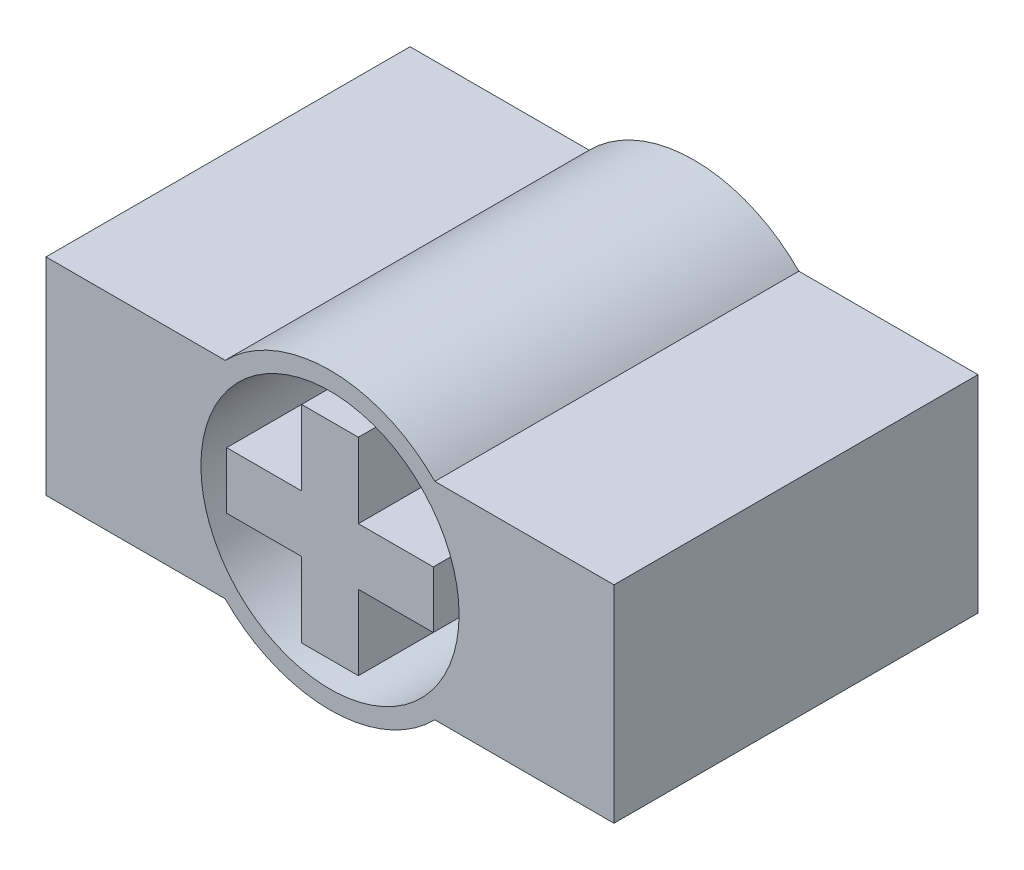
ISO-10303-21;
HEADER;
FILE_DESCRIPTION(('STEP AP214'),'2;1');
FILE_NAME('part.step','',(''),(''),'','','');
FILE_SCHEMA(('AUTOMOTIVE_DESIGN { 1 0 10303 214 1 1 1 1 }'));
ENDSEC;
DATA;
#1=APPLICATION_CONTEXT('core data for automotive mechanical design processes');
#2=APPLICATION_PROTOCOL_DEFINITION('international standard','automotive_design',2000,#1);
#3=PRODUCT_CONTEXT('',#1,'mechanical');
#4=PRODUCT('Part','Part','',(#3));
#5=PRODUCT_RELATED_PRODUCT_CATEGORY('part','',(#4));
#6=PRODUCT_DEFINITION_FORMATION('','',#4);
#7=PRODUCT_DEFINITION_CONTEXT('part definition',#1,'design');
#8=PRODUCT_DEFINITION('design','',#6,#7);
#9=PRODUCT_DEFINITION_SHAPE('','',#8);
#10=(LENGTH_UNIT() NAMED_UNIT(*) SI_UNIT(.MILLI.,.METRE.));
#11=(NAMED_UNIT(*) PLANE_ANGLE_UNIT() SI_UNIT($,.RADIAN.));
#12=(NAMED_UNIT(*) SI_UNIT($,.STERADIAN.) SOLID_ANGLE_UNIT());
#13=UNCERTAINTY_MEASURE_WITH_UNIT(LENGTH_MEASURE(1.E-05),#10,'distance_accuracy_value','');
#14=(GEOMETRIC_REPRESENTATION_CONTEXT(3) GLOBAL_UNCERTAINTY_ASSIGNED_CONTEXT((#13)) GLOBAL_UNIT_ASSIGNED_CONTEXT((#10,
#11,#12)) REPRESENTATION_CONTEXT('',''));
#15=CARTESIAN_POINT('',(0.,0.,0.));
#16=DIRECTION('',(0.,0.,1.));
#17=DIRECTION('',(1.,0.,0.));
#18=AXIS2_PLACEMENT_3D('',#15,#16,#17);
#19=CARTESIAN_POINT('',(2.,0.55,7.05));
#20=DIRECTION('',(-1.,0.,0.));
#21=DIRECTION('',(0.,0.,1.));
#22=AXIS2_PLACEMENT_3D('',#19,#20,#21);
#23=PLANE('',#22);
#24=DIRECTION('',(0.,0.,1.));
#25=VECTOR('',#24,1.);
#26=CARTESIAN_POINT('',(2.,-0.55,7.05));
#27=LINE('',#26,#25);
#28=CARTESIAN_POINT('',(2.,-0.55,7.05));
#29=VERTEX_POINT('',#28);
#30=CARTESIAN_POINT('',(2.,-0.55,3.05));
#31=VERTEX_POINT('',#30);
#32=EDGE_CURVE('E330',#29,#31,#27,.F.);
#33=ORIENTED_EDGE('',*,*,#32,.T.);
#34=DIRECTION('',(0.,1.,0.));
#35=VECTOR('',#34,1.);
#36=CARTESIAN_POINT('',(2.,0.55,3.05));
#37=LINE('',#36,#35);
#38=CARTESIAN_POINT('',(2.,0.55,3.05));
#39=VERTEX_POINT('',#38);
#40=EDGE_CURVE('E335',#39,#31,#37,.F.);
#41=ORIENTED_EDGE('',*,*,#40,.F.);
#42=DIRECTION('',(0.,0.,-1.));
#43=VECTOR('',#42,1.);
#44=CARTESIAN_POINT('',(2.,0.55,7.05));
#45=LINE('',#44,#43);
#46=CARTESIAN_POINT('',(2.,0.55,7.05));
#47=VERTEX_POINT('',#46);
#48=EDGE_CURVE('E319',#39,#47,#45,.F.);
#49=ORIENTED_EDGE('',*,*,#48,.T.);
#50=DIRECTION('',(0.,1.,0.));
#51=VECTOR('',#50,1.);
#52=CARTESIAN_POINT('',(2.,0.55,7.05));
#53=LINE('',#52,#51);
#54=EDGE_CURVE('E333',#29,#47,#53,.T.);
#55=ORIENTED_EDGE('',*,*,#54,.F.);
#56=EDGE_LOOP('',(#33,#41,#49,#55));
#57=FACE_BOUND('',#56,.T.);
#58=ADVANCED_FACE('F17',(#57),#23,.F.);
#59=CARTESIAN_POINT('',(2.,-0.55,7.05));
#60=DIRECTION('',(0.,1.,0.));
#61=DIRECTION('',(0.,0.,1.));
#62=AXIS2_PLACEMENT_3D('',#59,#60,#61);
#63=PLANE('',#62);
#64=DIRECTION('',(0.,0.,1.));
#65=VECTOR('',#64,1.);
#66=CARTESIAN_POINT('',(0.55,-0.55,7.05));
#67=LINE('',#66,#65);
#68=CARTESIAN_POINT('',(0.55,-0.55,7.05));
#69=VERTEX_POINT('',#68);
#70=CARTESIAN_POINT('',(0.55,-0.55,3.05));
#71=VERTEX_POINT('',#70);
#72=EDGE_CURVE('E314',#69,#71,#67,.F.);
#73=ORIENTED_EDGE('',*,*,#72,.T.);
#74=DIRECTION('',(1.,0.,0.));
#75=VECTOR('',#74,1.);
#76=CARTESIAN_POINT('',(2.,-0.55,3.05));
#77=LINE('',#76,#75);
#78=EDGE_CURVE('E328',#31,#71,#77,.F.);
#79=ORIENTED_EDGE('',*,*,#78,.F.);
#80=ORIENTED_EDGE('',*,*,#32,.F.);
#81=DIRECTION('',(1.,0.,0.));
#82=VECTOR('',#81,1.);
#83=CARTESIAN_POINT('',(2.,-0.55,7.05));
#84=LINE('',#83,#82);
#85=EDGE_CURVE('E325',#69,#29,#84,.T.);
#86=ORIENTED_EDGE('',*,*,#85,.F.);
#87=EDGE_LOOP('',(#73,#79,#80,#86));
#88=FACE_BOUND('',#87,.T.);
#89=ADVANCED_FACE('F584',(#88),#63,.F.);
#90=CARTESIAN_POINT('',(0.55,0.55,7.05));
#91=DIRECTION('',(0.,-1.,0.));
#92=DIRECTION('',(0.,0.,-1.));
#93=AXIS2_PLACEMENT_3D('',#90,#91,#92);
#94=PLANE('',#93);
#95=ORIENTED_EDGE('',*,*,#48,.F.);
#96=DIRECTION('',(1.,0.,0.));
#97=VECTOR('',#96,1.);
#98=CARTESIAN_POINT('',(0.55,0.55,3.05));
#99=LINE('',#98,#97);
#100=CARTESIAN_POINT('',(0.55,0.55,3.05));
#101=VERTEX_POINT('',#100);
#102=EDGE_CURVE('E322',#101,#39,#99,.T.);
#103=ORIENTED_EDGE('',*,*,#102,.F.);
#104=DIRECTION('',(0.,0.,1.));
#105=VECTOR('',#104,1.);
#106=CARTESIAN_POINT('',(0.55,0.55,7.05));
#107=LINE('',#106,#105);
#108=CARTESIAN_POINT('',(0.55,0.55,7.05));
#109=VERTEX_POINT('',#108);
#110=EDGE_CURVE('E303',#101,#109,#107,.T.);
#111=ORIENTED_EDGE('',*,*,#110,.T.);
#112=DIRECTION('',(1.,0.,0.));
#113=VECTOR('',#112,1.);
#114=CARTESIAN_POINT('',(0.55,0.55,7.05));
#115=LINE('',#114,#113);
#116=EDGE_CURVE('E317',#47,#109,#115,.F.);
#117=ORIENTED_EDGE('',*,*,#116,.F.);
#118=EDGE_LOOP('',(#95,#103,#111,#117));
#119=FACE_BOUND('',#118,.T.);
#120=ADVANCED_FACE('F575',(#119),#94,.F.);
#121=CARTESIAN_POINT('',(0.55,-0.55,7.05));
#122=DIRECTION('',(-1.,0.,0.));
#123=DIRECTION('',(0.,0.,1.));
#124=AXIS2_PLACEMENT_3D('',#121,#122,#123);
#125=PLANE('',#124);
#126=DIRECTION('',(0.,0.,1.));
#127=VECTOR('',#126,1.);
#128=CARTESIAN_POINT('',(0.55,-2.,7.05));
#129=LINE('',#128,#127);
#130=CARTESIAN_POINT('',(0.55,-2.,7.05));
#131=VERTEX_POINT('',#130);
#132=CARTESIAN_POINT('',(0.55,-2.,3.05));
#133=VERTEX_POINT('',#132);
#134=EDGE_CURVE('E298',#131,#133,#129,.F.);
#135=ORIENTED_EDGE('',*,*,#134,.T.);
#136=DIRECTION('',(0.,1.,0.));
#137=VECTOR('',#136,1.);
#138=CARTESIAN_POINT('',(0.55,-0.55,3.05));
#139=LINE('',#138,#137);
#140=EDGE_CURVE('E312',#71,#133,#139,.F.);
#141=ORIENTED_EDGE('',*,*,#140,.F.);
#142=ORIENTED_EDGE('',*,*,#72,.F.);
#143=DIRECTION('',(0.,1.,0.));
#144=VECTOR('',#143,1.);
#145=CARTESIAN_POINT('',(0.55,-0.55,7.05));
#146=LINE('',#145,#144);
#147=EDGE_CURVE('E309',#131,#69,#146,.T.);
#148=ORIENTED_EDGE('',*,*,#147,.F.);
#149=EDGE_LOOP('',(#135,#141,#142,#148));
#150=FACE_BOUND('',#149,.T.);
#151=ADVANCED_FACE('F566',(#150),#125,.F.);
#152=CARTESIAN_POINT('',(0.55,2.,7.05));
#153=DIRECTION('',(-1.,0.,0.));
#154=DIRECTION('',(0.,0.,1.));
#155=AXIS2_PLACEMENT_3D('',#152,#153,#154);
#156=PLANE('',#155);
#157=ORIENTED_EDGE('',*,*,#110,.F.);
#158=DIRECTION('',(0.,1.,0.));
#159=VECTOR('',#158,1.);
#160=CARTESIAN_POINT('',(0.55,2.,3.05));
#161=LINE('',#160,#159);
#162=CARTESIAN_POINT('',(0.55,2.,3.05));
#163=VERTEX_POINT('',#162);
#164=EDGE_CURVE('E306',#163,#101,#161,.F.);
#165=ORIENTED_EDGE('',*,*,#164,.F.);
#166=DIRECTION('',(0.,0.,-1.));
#167=VECTOR('',#166,1.);
#168=CARTESIAN_POINT('',(0.55,2.,7.05));
#169=LINE('',#168,#167);
#170=CARTESIAN_POINT('',(0.55,2.,7.05));
#171=VERTEX_POINT('',#170);
#172=EDGE_CURVE('E287',#163,#171,#169,.F.);
#173=ORIENTED_EDGE('',*,*,#172,.T.);
#174=DIRECTION('',(0.,1.,0.));
#175=VECTOR('',#174,1.);
#176=CARTESIAN_POINT('',(0.55,2.,7.05));
#177=LINE('',#176,#175);
#178=EDGE_CURVE('E301',#109,#171,#177,.T.);
#179=ORIENTED_EDGE('',*,*,#178,.F.);
#180=EDGE_LOOP('',(#157,#165,#173,#179));
#181=FACE_BOUND('',#180,.T.);
#182=ADVANCED_FACE('F557',(#181),#156,.F.);
#183=CARTESIAN_POINT('',(0.55,-2.,7.05));
#184=DIRECTION('',(0.,1.,0.));
#185=DIRECTION('',(0.,0.,1.));
#186=AXIS2_PLACEMENT_3D('',#183,#184,#185);
#187=PLANE('',#186);
#188=DIRECTION('',(0.,0.,-1.));
#189=VECTOR('',#188,1.);
#190=CARTESIAN_POINT('',(-0.55,-2.,7.05));
#191=LINE('',#190,#189);
#192=CARTESIAN_POINT('',(-0.55,-2.,7.05));
#193=VERTEX_POINT('',#192);
#194=CARTESIAN_POINT('',(-0.55,-2.,3.05));
#195=VERTEX_POINT('',#194);
#196=EDGE_CURVE('E282',#193,#195,#191,.T.);
#197=ORIENTED_EDGE('',*,*,#196,.T.);
#198=DIRECTION('',(1.,0.,0.));
#199=VECTOR('',#198,1.);
#200=CARTESIAN_POINT('',(0.55,-2.,3.05));
#201=LINE('',#200,#199);
#202=EDGE_CURVE('E296',#133,#195,#201,.F.);
#203=ORIENTED_EDGE('',*,*,#202,.F.);
#204=ORIENTED_EDGE('',*,*,#134,.F.);
#205=DIRECTION('',(1.,0.,0.));
#206=VECTOR('',#205,1.);
#207=CARTESIAN_POINT('',(0.55,-2.,7.05));
#208=LINE('',#207,#206);
#209=EDGE_CURVE('E293',#193,#131,#208,.T.);
#210=ORIENTED_EDGE('',*,*,#209,.F.);
#211=EDGE_LOOP('',(#197,#203,#204,#210));
#212=FACE_BOUND('',#211,.T.);
#213=ADVANCED_FACE('F548',(#212),#187,.F.);
#214=CARTESIAN_POINT('',(-0.55,2.,7.05));
#215=DIRECTION('',(0.,-1.,0.));
#216=DIRECTION('',(0.,0.,-1.));
#217=AXIS2_PLACEMENT_3D('',#214,#215,#216);
#218=PLANE('',#217);
#219=ORIENTED_EDGE('',*,*,#172,.F.);
#220=DIRECTION('',(1.,0.,0.));
#221=VECTOR('',#220,1.);
#222=CARTESIAN_POINT('',(-0.55,2.,3.05));
#223=LINE('',#222,#221);
#224=CARTESIAN_POINT('',(-0.55,2.,3.05));
#225=VERTEX_POINT('',#224);
#226=EDGE_CURVE('E290',#225,#163,#223,.T.);
#227=ORIENTED_EDGE('',*,*,#226,.F.);
#228=DIRECTION('',(0.,0.,-1.));
#229=VECTOR('',#228,1.);
#230=CARTESIAN_POINT('',(-0.55,2.,7.05));
#231=LINE('',#230,#229);
#232=CARTESIAN_POINT('',(-0.55,2.,7.05));
#233=VERTEX_POINT('',#232);
#234=EDGE_CURVE('E272',#225,#233,#231,.F.);
#235=ORIENTED_EDGE('',*,*,#234,.T.);
#236=DIRECTION('',(1.,0.,0.));
#237=VECTOR('',#236,1.);
#238=CARTESIAN_POINT('',(-0.55,2.,7.05));
#239=LINE('',#238,#237);
#240=EDGE_CURVE('E285',#171,#233,#239,.F.);
#241=ORIENTED_EDGE('',*,*,#240,.F.);
#242=EDGE_LOOP('',(#219,#227,#235,#241));
#243=FACE_BOUND('',#242,.T.);
#244=ADVANCED_FACE('F539',(#243),#218,.F.);
#245=CARTESIAN_POINT('',(-0.55,-2.,7.05));
#246=DIRECTION('',(1.,0.,0.));
#247=DIRECTION('',(0.,0.,-1.));
#248=AXIS2_PLACEMENT_3D('',#245,#246,#247);
#249=PLANE('',#248);
#250=DIRECTION('',(0.,0.,1.));
#251=VECTOR('',#250,1.);
#252=CARTESIAN_POINT('',(-0.55,-0.55,7.05));
#253=LINE('',#252,#251);
#254=CARTESIAN_POINT('',(-0.55,-0.55,7.05));
#255=VERTEX_POINT('',#254);
#256=CARTESIAN_POINT('',(-0.55,-0.55,3.05));
#257=VERTEX_POINT('',#256);
#258=EDGE_CURVE('E175',#255,#257,#253,.F.);
#259=ORIENTED_EDGE('',*,*,#258,.T.);
#260=DIRECTION('',(0.,1.,0.));
#261=VECTOR('',#260,1.);
#262=CARTESIAN_POINT('',(-0.55,-2.,3.05));
#263=LINE('',#262,#261);
#264=EDGE_CURVE('E170',#195,#257,#263,.T.);
#265=ORIENTED_EDGE('',*,*,#264,.F.);
#266=ORIENTED_EDGE('',*,*,#196,.F.);
#267=DIRECTION('',(0.,1.,0.));
#268=VECTOR('',#267,1.);
#269=CARTESIAN_POINT('',(-0.55,-2.,7.05));
#270=LINE('',#269,#268);
#271=EDGE_CURVE('E278',#255,#193,#270,.F.);
#272=ORIENTED_EDGE('',*,*,#271,.F.);
#273=EDGE_LOOP('',(#259,#265,#266,#272));
#274=FACE_BOUND('',#273,.T.);
#275=ADVANCED_FACE('F530',(#274),#249,.F.);
#276=CARTESIAN_POINT('',(-0.55,0.55,7.05));
#277=DIRECTION('',(1.,0.,0.));
#278=DIRECTION('',(0.,0.,-1.));
#279=AXIS2_PLACEMENT_3D('',#276,#277,#278);
#280=PLANE('',#279);
#281=ORIENTED_EDGE('',*,*,#234,.F.);
#282=DIRECTION('',(0.,1.,0.));
#283=VECTOR('',#282,1.);
#284=CARTESIAN_POINT('',(-0.55,0.55,3.05));
#285=LINE('',#284,#283);
#286=CARTESIAN_POINT('',(-0.55,0.55,3.05));
#287=VERTEX_POINT('',#286);
#288=EDGE_CURVE('E275',#287,#225,#285,.T.);
#289=ORIENTED_EDGE('',*,*,#288,.F.);
#290=DIRECTION('',(0.,0.,-1.));
#291=VECTOR('',#290,1.);
#292=CARTESIAN_POINT('',(-0.55,0.55,7.05));
#293=LINE('',#292,#291);
#294=CARTESIAN_POINT('',(-0.55,0.55,7.05));
#295=VERTEX_POINT('',#294);
#296=EDGE_CURVE('E265',#287,#295,#293,.F.);
#297=ORIENTED_EDGE('',*,*,#296,.T.);
#298=DIRECTION('',(0.,1.,0.));
#299=VECTOR('',#298,1.);
#300=CARTESIAN_POINT('',(-0.55,0.55,7.05));
#301=LINE('',#300,#299);
#302=EDGE_CURVE('E270',#233,#295,#301,.F.);
#303=ORIENTED_EDGE('',*,*,#302,.F.);
#304=EDGE_LOOP('',(#281,#289,#297,#303));
#305=FACE_BOUND('',#304,.T.);
#306=ADVANCED_FACE('F522',(#305),#280,.F.);
#307=CARTESIAN_POINT('',(-0.55,-0.55,7.05));
#308=DIRECTION('',(0.,1.,0.));
#309=DIRECTION('',(0.,0.,1.));
#310=AXIS2_PLACEMENT_3D('',#307,#308,#309);
#311=PLANE('',#310);
#312=DIRECTION('',(0.,0.,-1.));
#313=VECTOR('',#312,1.);
#314=CARTESIAN_POINT('',(-2.,-0.55,7.05));
#315=LINE('',#314,#313);
#316=CARTESIAN_POINT('',(-2.,-0.55,7.05));
#317=VERTEX_POINT('',#316);
#318=CARTESIAN_POINT('',(-2.,-0.55,3.05));
#319=VERTEX_POINT('',#318);
#320=EDGE_CURVE('E178',#317,#319,#315,.T.);
#321=ORIENTED_EDGE('',*,*,#320,.T.);
#322=DIRECTION('',(1.,0.,0.));
#323=VECTOR('',#322,1.);
#324=CARTESIAN_POINT('',(-0.55,-0.55,3.05));
#325=LINE('',#324,#323);
#326=EDGE_CURVE('E162',#257,#319,#325,.F.);
#327=ORIENTED_EDGE('',*,*,#326,.F.);
#328=ORIENTED_EDGE('',*,*,#258,.F.);
#329=DIRECTION('',(1.,0.,0.));
#330=VECTOR('',#329,1.);
#331=CARTESIAN_POINT('',(0.,-0.55,7.05));
#332=LINE('',#331,#330);
#333=EDGE_CURVE('E181',#317,#255,#332,.T.);
#334=ORIENTED_EDGE('',*,*,#333,.F.);
#335=EDGE_LOOP('',(#321,#327,#328,#334));
#336=FACE_BOUND('',#335,.T.);
#337=ADVANCED_FACE('F179',(#336),#311,.F.);
#338=CARTESIAN_POINT('',(-2.,0.55,7.05));
#339=DIRECTION('',(0.,-1.,0.));
#340=DIRECTION('',(0.,0.,-1.));
#341=AXIS2_PLACEMENT_3D('',#338,#339,#340);
#342=PLANE('',#341);
#343=ORIENTED_EDGE('',*,*,#296,.F.);
#344=DIRECTION('',(1.,0.,0.));
#345=VECTOR('',#344,1.);
#346=CARTESIAN_POINT('',(-2.,0.55,3.05));
#347=LINE('',#346,#345);
#348=CARTESIAN_POINT('',(-2.,0.55,3.05));
#349=VERTEX_POINT('',#348);
#350=EDGE_CURVE('E174',#349,#287,#347,.T.);
#351=ORIENTED_EDGE('',*,*,#350,.F.);
#352=DIRECTION('',(0.,0.,-1.));
#353=VECTOR('',#352,1.);
#354=CARTESIAN_POINT('',(-2.,0.55,7.05));
#355=LINE('',#354,#353);
#356=CARTESIAN_POINT('',(-2.,0.55,7.05));
#357=VERTEX_POINT('',#356);
#358=EDGE_CURVE('E183',#349,#357,#355,.F.);
#359=ORIENTED_EDGE('',*,*,#358,.T.);
#360=DIRECTION('',(1.,0.,0.));
#361=VECTOR('',#360,1.);
#362=CARTESIAN_POINT('',(0.,0.55,7.05));
#363=LINE('',#362,#361);
#364=EDGE_CURVE('E152',#295,#357,#363,.F.);
#365=ORIENTED_EDGE('',*,*,#364,.F.);
#366=EDGE_LOOP('',(#343,#351,#359,#365));
#367=FACE_BOUND('',#366,.T.);
#368=ADVANCED_FACE('F506',(#367),#342,.F.);
#369=CARTESIAN_POINT('',(0.,0.,7.05));
#370=DIRECTION('',(0.,0.,1.));
#371=DIRECTION('',(1.,0.,0.));
#372=AXIS2_PLACEMENT_3D('',#369,#370,#371);
#373=PLANE('',#372);
#374=ORIENTED_EDGE('',*,*,#240,.T.);
#375=ORIENTED_EDGE('',*,*,#302,.T.);
#376=ORIENTED_EDGE('',*,*,#364,.T.);
#377=DIRECTION('',(0.,1.,0.));
#378=VECTOR('',#377,1.);
#379=CARTESIAN_POINT('',(-2.,-0.55,7.05));
#380=LINE('',#379,#378);
#381=EDGE_CURVE('E243',#357,#317,#380,.F.);
#382=ORIENTED_EDGE('',*,*,#381,.T.);
#383=ORIENTED_EDGE('',*,*,#333,.T.);
#384=ORIENTED_EDGE('',*,*,#271,.T.);
#385=ORIENTED_EDGE('',*,*,#209,.T.);
#386=ORIENTED_EDGE('',*,*,#147,.T.);
#387=ORIENTED_EDGE('',*,*,#85,.T.);
#388=ORIENTED_EDGE('',*,*,#54,.T.);
#389=ORIENTED_EDGE('',*,*,#116,.T.);
#390=ORIENTED_EDGE('',*,*,#178,.T.);
#391=EDGE_LOOP('',(#374,#375,#376,#382,#383,#384,#385,#386,#387,#388,#389,#390));
#392=FACE_BOUND('',#391,.T.);
#393=ADVANCED_FACE('F498',(#392),#373,.T.);
#394=CARTESIAN_POINT('',(0.,0.,0.));
#395=DIRECTION('',(0.,0.,1.));
#396=DIRECTION('',(1.,0.,0.));
#397=AXIS2_PLACEMENT_3D('',#394,#395,#396);
#398=PLANE('',#397);
#399=DIRECTION('',(0.,1.,0.));
#400=VECTOR('',#399,1.);
#401=CARTESIAN_POINT('',(5.5,2.,0.));
#402=LINE('',#401,#400);
#403=CARTESIAN_POINT('',(5.5,-2.,0.));
#404=VERTEX_POINT('',#403);
#405=CARTESIAN_POINT('',(5.5,2.,0.));
#406=VERTEX_POINT('',#405);
#407=EDGE_CURVE('E189',#404,#406,#402,.T.);
#408=ORIENTED_EDGE('',*,*,#407,.F.);
#409=DIRECTION('',(1.,0.,0.));
#410=VECTOR('',#409,1.);
#411=CARTESIAN_POINT('',(5.5,-2.,0.));
#412=LINE('',#411,#410);
#413=CARTESIAN_POINT('',(2.03039405042485,-2.,0.));
#414=VERTEX_POINT('',#413);
#415=EDGE_CURVE('E202',#414,#404,#412,.T.);
#416=ORIENTED_EDGE('',*,*,#415,.F.);
#417=CARTESIAN_POINT('',(0.,0.,0.));
#418=DIRECTION('',(0.,0.,-1.));
#419=DIRECTION('',(-1.,0.,0.));
#420=AXIS2_PLACEMENT_3D('',#417,#418,#419);
#421=CIRCLE('',#420,2.85);
#422=CARTESIAN_POINT('',(-2.03039405042477,-1.99999999999992,0.));
#423=VERTEX_POINT('',#422);
#424=EDGE_CURVE('E215',#423,#414,#421,.F.);
#425=ORIENTED_EDGE('',*,*,#424,.F.);
#426=DIRECTION('',(1.,0.,0.));
#427=VECTOR('',#426,1.);
#428=CARTESIAN_POINT('',(-2.030394050425,-2.,0.));
#429=LINE('',#428,#427);
#430=CARTESIAN_POINT('',(-5.5,-2.,0.));
#431=VERTEX_POINT('',#430);
#432=EDGE_CURVE('E219',#431,#423,#429,.T.);
#433=ORIENTED_EDGE('',*,*,#432,.F.);
#434=DIRECTION('',(0.,1.,0.));
#435=VECTOR('',#434,1.);
#436=CARTESIAN_POINT('',(-5.5,-2.,0.));
#437=LINE('',#436,#435);
#438=CARTESIAN_POINT('',(-5.5,2.,0.));
#439=VERTEX_POINT('',#438);
#440=EDGE_CURVE('E220',#439,#431,#437,.F.);
#441=ORIENTED_EDGE('',*,*,#440,.F.);
#442=DIRECTION('',(1.,0.,0.));
#443=VECTOR('',#442,1.);
#444=CARTESIAN_POINT('',(-5.5,2.,0.));
#445=LINE('',#444,#443);
#446=CARTESIAN_POINT('',(-2.03039405042485,2.,0.));
#447=VERTEX_POINT('',#446);
#448=EDGE_CURVE('E232',#447,#439,#445,.F.);
#449=ORIENTED_EDGE('',*,*,#448,.F.);
#450=CARTESIAN_POINT('',(0.,0.,0.));
#451=DIRECTION('',(0.,0.,-1.));
#452=DIRECTION('',(-1.,0.,0.));
#453=AXIS2_PLACEMENT_3D('',#450,#451,#452);
#454=CIRCLE('',#453,2.85);
#455=CARTESIAN_POINT('',(2.03039405042477,1.99999999999992,0.));
#456=VERTEX_POINT('',#455);
#457=EDGE_CURVE('E20',#456,#447,#454,.F.);
#458=ORIENTED_EDGE('',*,*,#457,.F.);
#459=DIRECTION('',(1.,0.,0.));
#460=VECTOR('',#459,1.);
#461=CARTESIAN_POINT('',(2.030394050425,2.,0.));
#462=LINE('',#461,#460);
#463=EDGE_CURVE('E145',#406,#456,#462,.F.);
#464=ORIENTED_EDGE('',*,*,#463,.F.);
#465=EDGE_LOOP('',(#408,#416,#425,#433,#441,#449,#458,#464));
#466=FACE_BOUND('',#465,.T.);
#467=ADVANCED_FACE('F353',(#466),#398,.F.);
#468=CARTESIAN_POINT('',(-2.,-0.55,7.05));
#469=DIRECTION('',(1.,0.,0.));
#470=DIRECTION('',(0.,0.,-1.));
#471=AXIS2_PLACEMENT_3D('',#468,#469,#470);
#472=PLANE('',#471);
#473=ORIENTED_EDGE('',*,*,#358,.F.);
#474=DIRECTION('',(0.,1.,0.));
#475=VECTOR('',#474,1.);
#476=CARTESIAN_POINT('',(-2.,0.,3.05));
#477=LINE('',#476,#475);
#478=EDGE_CURVE('E168',#319,#349,#477,.T.);
#479=ORIENTED_EDGE('',*,*,#478,.F.);
#480=ORIENTED_EDGE('',*,*,#320,.F.);
#481=ORIENTED_EDGE('',*,*,#381,.F.);
#482=EDGE_LOOP('',(#473,#479,#480,#481));
#483=FACE_BOUND('',#482,.T.);
#484=ADVANCED_FACE('F186',(#483),#472,.F.);
#485=CARTESIAN_POINT('',(2.030394050425,2.,0.));
#486=DIRECTION('',(0.,1.,0.));
#487=DIRECTION('',(0.,0.,1.));
#488=AXIS2_PLACEMENT_3D('',#485,#486,#487);
#489=PLANE('',#488);
#490=DIRECTION('',(0.,0.,-1.));
#491=VECTOR('',#490,1.);
#492=CARTESIAN_POINT('',(5.5,2.,0.));
#493=LINE('',#492,#491);
#494=CARTESIAN_POINT('',(5.5,2.,7.05));
#495=VERTEX_POINT('',#494);
#496=EDGE_CURVE('E206',#406,#495,#493,.F.);
#497=ORIENTED_EDGE('',*,*,#496,.F.);
#498=ORIENTED_EDGE('',*,*,#463,.T.);
#499=DIRECTION('',(0.,0.,-1.));
#500=VECTOR('',#499,1.);
#501=CARTESIAN_POINT('',(2.03039405042485,1.99999999999985,0.));
#502=LINE('',#501,#500);
#503=CARTESIAN_POINT('',(2.03039405042477,1.99999999999992,7.05));
#504=VERTEX_POINT('',#503);
#505=EDGE_CURVE('E238',#504,#456,#502,.T.);
#506=ORIENTED_EDGE('',*,*,#505,.F.);
#507=DIRECTION('',(1.,0.,0.));
#508=VECTOR('',#507,1.);
#509=CARTESIAN_POINT('',(0.,2.,7.05));
#510=LINE('',#509,#508);
#511=EDGE_CURVE('E188',#495,#504,#510,.F.);
#512=ORIENTED_EDGE('',*,*,#511,.F.);
#513=EDGE_LOOP('',(#497,#498,#506,#512));
#514=FACE_BOUND('',#513,.T.);
#515=ADVANCED_FACE('F359',(#514),#489,.T.);
#516=CARTESIAN_POINT('',(0.,0.,0.));
#517=DIRECTION('',(0.,0.,-1.));
#518=DIRECTION('',(-1.,0.,0.));
#519=AXIS2_PLACEMENT_3D('',#516,#517,#518);
#520=CYLINDRICAL_SURFACE('',#519,2.85);
#521=CARTESIAN_POINT('',(0.,0.,7.05));
#522=DIRECTION('',(0.,0.,-1.));
#523=DIRECTION('',(-1.,0.,0.));
#524=AXIS2_PLACEMENT_3D('',#521,#522,#523);
#525=CIRCLE('',#524,2.85);
#526=CARTESIAN_POINT('',(-2.03039405042485,2.,7.05));
#527=VERTEX_POINT('',#526);
#528=EDGE_CURVE('E191',#504,#527,#525,.F.);
#529=ORIENTED_EDGE('',*,*,#528,.F.);
#530=ORIENTED_EDGE('',*,*,#505,.T.);
#531=ORIENTED_EDGE('',*,*,#457,.T.);
#532=DIRECTION('',(0.,0.,1.));
#533=VECTOR('',#532,1.);
#534=CARTESIAN_POINT('',(-2.030394050425,2.,0.));
#535=LINE('',#534,#533);
#536=EDGE_CURVE('E235',#527,#447,#535,.F.);
#537=ORIENTED_EDGE('',*,*,#536,.F.);
#538=EDGE_LOOP('',(#529,#530,#531,#537));
#539=FACE_BOUND('',#538,.T.);
#540=ADVANCED_FACE('F366',(#539),#520,.T.);
#541=CARTESIAN_POINT('',(-5.5,2.,0.));
#542=DIRECTION('',(0.,1.,0.));
#543=DIRECTION('',(0.,0.,1.));
#544=AXIS2_PLACEMENT_3D('',#541,#542,#543);
#545=PLANE('',#544);
#546=ORIENTED_EDGE('',*,*,#536,.T.);
#547=ORIENTED_EDGE('',*,*,#448,.T.);
#548=DIRECTION('',(0.,0.,1.));
#549=VECTOR('',#548,1.);
#550=CARTESIAN_POINT('',(-5.5,2.,0.));
#551=LINE('',#550,#549);
#552=CARTESIAN_POINT('',(-5.5,2.,7.05));
#553=VERTEX_POINT('',#552);
#554=EDGE_CURVE('E229',#553,#439,#551,.F.);
#555=ORIENTED_EDGE('',*,*,#554,.F.);
#556=DIRECTION('',(1.,0.,0.));
#557=VECTOR('',#556,1.);
#558=CARTESIAN_POINT('',(0.,2.,7.05));
#559=LINE('',#558,#557);
#560=EDGE_CURVE('E226',#527,#553,#559,.F.);
#561=ORIENTED_EDGE('',*,*,#560,.F.);
#562=EDGE_LOOP('',(#546,#547,#555,#561));
#563=FACE_BOUND('',#562,.T.);
#564=ADVANCED_FACE('F369',(#563),#545,.T.);
#565=CARTESIAN_POINT('',(-5.5,-2.,0.));
#566=DIRECTION('',(-1.,0.,0.));
#567=DIRECTION('',(0.,0.,1.));
#568=AXIS2_PLACEMENT_3D('',#565,#566,#567);
#569=PLANE('',#568);
#570=ORIENTED_EDGE('',*,*,#554,.T.);
#571=ORIENTED_EDGE('',*,*,#440,.T.);
#572=DIRECTION('',(0.,0.,-1.));
#573=VECTOR('',#572,1.);
#574=CARTESIAN_POINT('',(-5.5,-2.,0.));
#575=LINE('',#574,#573);
#576=CARTESIAN_POINT('',(-5.5,-2.,7.05));
#577=VERTEX_POINT('',#576);
#578=EDGE_CURVE('E216',#577,#431,#575,.T.);
#579=ORIENTED_EDGE('',*,*,#578,.F.);
#580=DIRECTION('',(0.,1.,0.));
#581=VECTOR('',#580,1.);
#582=CARTESIAN_POINT('',(-5.5,0.,7.05));
#583=LINE('',#582,#581);
#584=EDGE_CURVE('E223',#553,#577,#583,.F.);
#585=ORIENTED_EDGE('',*,*,#584,.F.);
#586=EDGE_LOOP('',(#570,#571,#579,#585));
#587=FACE_BOUND('',#586,.T.);
#588=ADVANCED_FACE('F386',(#587),#569,.T.);
#589=CARTESIAN_POINT('',(-2.030394050425,-2.,0.));
#590=DIRECTION('',(0.,-1.,0.));
#591=DIRECTION('',(0.,0.,-1.));
#592=AXIS2_PLACEMENT_3D('',#589,#590,#591);
#593=PLANE('',#592);
#594=ORIENTED_EDGE('',*,*,#578,.T.);
#595=ORIENTED_EDGE('',*,*,#432,.T.);
#596=DIRECTION('',(0.,0.,-1.));
#597=VECTOR('',#596,1.);
#598=CARTESIAN_POINT('',(-2.03039405042484,-1.99999999999985,0.));
#599=LINE('',#598,#597);
#600=CARTESIAN_POINT('',(-2.03039405042477,-1.99999999999992,7.05));
#601=VERTEX_POINT('',#600);
#602=EDGE_CURVE('E203',#601,#423,#599,.T.);
#603=ORIENTED_EDGE('',*,*,#602,.F.);
#604=DIRECTION('',(1.,0.,0.));
#605=VECTOR('',#604,1.);
#606=CARTESIAN_POINT('',(0.,-2.,7.05));
#607=LINE('',#606,#605);
#608=EDGE_CURVE('E225',#577,#601,#607,.T.);
#609=ORIENTED_EDGE('',*,*,#608,.F.);
#610=EDGE_LOOP('',(#594,#595,#603,#609));
#611=FACE_BOUND('',#610,.T.);
#612=ADVANCED_FACE('F383',(#611),#593,.T.);
#613=CARTESIAN_POINT('',(0.,0.,0.));
#614=DIRECTION('',(0.,0.,-1.));
#615=DIRECTION('',(-1.,0.,0.));
#616=AXIS2_PLACEMENT_3D('',#613,#614,#615);
#617=CYLINDRICAL_SURFACE('',#616,2.85);
#618=CARTESIAN_POINT('',(0.,0.,7.05));
#619=DIRECTION('',(0.,0.,-1.));
#620=DIRECTION('',(-1.,0.,0.));
#621=AXIS2_PLACEMENT_3D('',#618,#619,#620);
#622=CIRCLE('',#621,2.85);
#623=CARTESIAN_POINT('',(2.03039405042485,-2.,7.05));
#624=VERTEX_POINT('',#623);
#625=EDGE_CURVE('E339',#601,#624,#622,.F.);
#626=ORIENTED_EDGE('',*,*,#625,.F.);
#627=ORIENTED_EDGE('',*,*,#602,.T.);
#628=ORIENTED_EDGE('',*,*,#424,.T.);
#629=DIRECTION('',(0.,0.,-1.));
#630=VECTOR('',#629,1.);
#631=CARTESIAN_POINT('',(2.030394050425,-2.,0.));
#632=LINE('',#631,#630);
#633=EDGE_CURVE('E199',#624,#414,#632,.T.);
#634=ORIENTED_EDGE('',*,*,#633,.F.);
#635=EDGE_LOOP('',(#626,#627,#628,#634));
#636=FACE_BOUND('',#635,.T.);
#637=ADVANCED_FACE('F345',(#636),#617,.T.);
#638=CARTESIAN_POINT('',(5.5,-2.,0.));
#639=DIRECTION('',(0.,-1.,0.));
#640=DIRECTION('',(0.,0.,-1.));
#641=AXIS2_PLACEMENT_3D('',#638,#639,#640);
#642=PLANE('',#641);
#643=ORIENTED_EDGE('',*,*,#633,.T.);
#644=ORIENTED_EDGE('',*,*,#415,.T.);
#645=DIRECTION('',(0.,0.,-1.));
#646=VECTOR('',#645,1.);
#647=CARTESIAN_POINT('',(5.5,-2.,0.));
#648=LINE('',#647,#646);
#649=CARTESIAN_POINT('',(5.5,-2.,7.05));
#650=VERTEX_POINT('',#649);
#651=EDGE_CURVE('E194',#650,#404,#648,.T.);
#652=ORIENTED_EDGE('',*,*,#651,.F.);
#653=DIRECTION('',(1.,0.,0.));
#654=VECTOR('',#653,1.);
#655=CARTESIAN_POINT('',(0.,-2.,7.05));
#656=LINE('',#655,#654);
#657=EDGE_CURVE('E35',#624,#650,#656,.T.);
#658=ORIENTED_EDGE('',*,*,#657,.F.);
#659=EDGE_LOOP('',(#643,#644,#652,#658));
#660=FACE_BOUND('',#659,.T.);
#661=ADVANCED_FACE('F351',(#660),#642,.T.);
#662=CARTESIAN_POINT('',(5.5,2.,0.));
#663=DIRECTION('',(1.,0.,0.));
#664=DIRECTION('',(0.,0.,-1.));
#665=AXIS2_PLACEMENT_3D('',#662,#663,#664);
#666=PLANE('',#665);
#667=ORIENTED_EDGE('',*,*,#651,.T.);
#668=ORIENTED_EDGE('',*,*,#407,.T.);
#669=ORIENTED_EDGE('',*,*,#496,.T.);
#670=DIRECTION('',(0.,1.,0.));
#671=VECTOR('',#670,1.);
#672=CARTESIAN_POINT('',(5.5,0.,7.05));
#673=LINE('',#672,#671);
#674=EDGE_CURVE('E209',#650,#495,#673,.T.);
#675=ORIENTED_EDGE('',*,*,#674,.F.);
#676=EDGE_LOOP('',(#667,#668,#669,#675));
#677=FACE_BOUND('',#676,.T.);
#678=ADVANCED_FACE('F356',(#677),#666,.T.);
#679=CARTESIAN_POINT('',(0.,0.,3.05));
#680=DIRECTION('',(0.,0.,1.));
#681=DIRECTION('',(1.,0.,0.));
#682=AXIS2_PLACEMENT_3D('',#679,#680,#681);
#683=PLANE('',#682);
#684=ORIENTED_EDGE('',*,*,#326,.T.);
#685=ORIENTED_EDGE('',*,*,#478,.T.);
#686=ORIENTED_EDGE('',*,*,#350,.T.);
#687=ORIENTED_EDGE('',*,*,#288,.T.);
#688=ORIENTED_EDGE('',*,*,#226,.T.);
#689=ORIENTED_EDGE('',*,*,#164,.T.);
#690=ORIENTED_EDGE('',*,*,#102,.T.);
#691=ORIENTED_EDGE('',*,*,#40,.T.);
#692=ORIENTED_EDGE('',*,*,#78,.T.);
#693=ORIENTED_EDGE('',*,*,#140,.T.);
#694=ORIENTED_EDGE('',*,*,#202,.T.);
#695=ORIENTED_EDGE('',*,*,#264,.T.);
#696=EDGE_LOOP('',(#684,#685,#686,#687,#688,#689,#690,#691,#692,#693,#694,#695));
#697=FACE_BOUND('',#696,.T.);
#698=CARTESIAN_POINT('',(0.,0.,3.05));
#699=DIRECTION('',(0.,0.,1.));
#700=DIRECTION('',(1.,0.,0.));
#701=AXIS2_PLACEMENT_3D('',#698,#699,#700);
#702=CIRCLE('',#701,2.5);
#703=CARTESIAN_POINT('',(2.5,0.,3.05));
#704=VERTEX_POINT('',#703);
#705=EDGE_CURVE('E26',#704,#704,#702,.T.);
#706=ORIENTED_EDGE('',*,*,#705,.T.);
#707=EDGE_LOOP('',(#706));
#708=FACE_BOUND('',#707,.T.);
#709=ADVANCED_FACE('F164',(#697,#708),#683,.T.);
#710=CARTESIAN_POINT('',(0.,0.,7.05));
#711=DIRECTION('',(0.,0.,1.));
#712=DIRECTION('',(1.,0.,0.));
#713=AXIS2_PLACEMENT_3D('',#710,#711,#712);
#714=PLANE('',#713);
#715=CARTESIAN_POINT('',(0.,0.,7.05));
#716=DIRECTION('',(0.,0.,1.));
#717=DIRECTION('',(1.,0.,0.));
#718=AXIS2_PLACEMENT_3D('',#715,#716,#717);
#719=CIRCLE('',#718,2.5);
#720=CARTESIAN_POINT('',(2.5,0.,7.05));
#721=VERTEX_POINT('',#720);
#722=EDGE_CURVE('E11',#721,#721,#719,.F.);
#723=ORIENTED_EDGE('',*,*,#722,.T.);
#724=EDGE_LOOP('',(#723));
#725=FACE_BOUND('',#724,.T.);
#726=ORIENTED_EDGE('',*,*,#657,.T.);
#727=ORIENTED_EDGE('',*,*,#674,.T.);
#728=ORIENTED_EDGE('',*,*,#511,.T.);
#729=ORIENTED_EDGE('',*,*,#528,.T.);
#730=ORIENTED_EDGE('',*,*,#560,.T.);
#731=ORIENTED_EDGE('',*,*,#584,.T.);
#732=ORIENTED_EDGE('',*,*,#608,.T.);
#733=ORIENTED_EDGE('',*,*,#625,.T.);
#734=EDGE_LOOP('',(#726,#727,#728,#729,#730,#731,#732,#733));
#735=FACE_BOUND('',#734,.T.);
#736=ADVANCED_FACE('F361',(#725,#735),#714,.T.);
#737=CARTESIAN_POINT('',(0.,0.,7.05));
#738=DIRECTION('',(0.,0.,1.));
#739=DIRECTION('',(1.,0.,0.));
#740=AXIS2_PLACEMENT_3D('',#737,#738,#739);
#741=CYLINDRICAL_SURFACE('',#740,2.5);
#742=ORIENTED_EDGE('',*,*,#705,.F.);
#743=EDGE_LOOP('',(#742));
#744=FACE_BOUND('',#743,.T.);
#745=ORIENTED_EDGE('',*,*,#722,.F.);
#746=EDGE_LOOP('',(#745));
#747=FACE_BOUND('',#746,.T.);
#748=ADVANCED_FACE('F396',(#744,#747),#741,.F.);
#749=CLOSED_SHELL('',(#58,#89,#120,#151,#182,#213,#244,#275,#306,#337,#368,#393,#467,#484,#515,
#540,#564,#588,#612,#637,#661,#678,#709,#736,#748));
#750=MANIFOLD_SOLID_BREP('B1',#749);
#751=ADVANCED_BREP_SHAPE_REPRESENTATION('',(#18,#750),#14);
#752=SHAPE_DEFINITION_REPRESENTATION(#9,#751);
ENDSEC;
END-ISO-10303-21;
